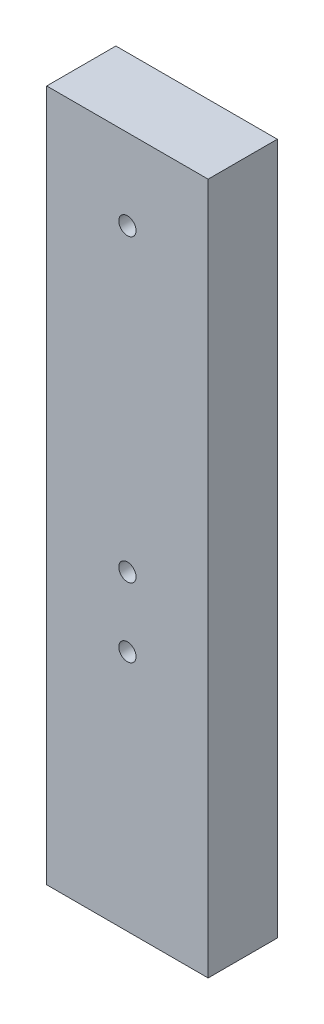
ISO-10303-21;
HEADER;
FILE_DESCRIPTION(('STEP AP214'),'2;1');
FILE_NAME('part.step','',(''),(''),'','','');
FILE_SCHEMA(('AUTOMOTIVE_DESIGN { 1 0 10303 214 1 1 1 1 }'));
ENDSEC;
DATA;
#1=APPLICATION_CONTEXT('core data for automotive mechanical design processes');
#2=APPLICATION_PROTOCOL_DEFINITION('international standard','automotive_design',2000,#1);
#3=PRODUCT_CONTEXT('',#1,'mechanical');
#4=PRODUCT('Part','Part','',(#3));
#5=PRODUCT_RELATED_PRODUCT_CATEGORY('part','',(#4));
#6=PRODUCT_DEFINITION_FORMATION('','',#4);
#7=PRODUCT_DEFINITION_CONTEXT('part definition',#1,'design');
#8=PRODUCT_DEFINITION('design','',#6,#7);
#9=PRODUCT_DEFINITION_SHAPE('','',#8);
#10=(LENGTH_UNIT() NAMED_UNIT(*) SI_UNIT(.MILLI.,.METRE.));
#11=(NAMED_UNIT(*) PLANE_ANGLE_UNIT() SI_UNIT($,.RADIAN.));
#12=(NAMED_UNIT(*) SI_UNIT($,.STERADIAN.) SOLID_ANGLE_UNIT());
#13=UNCERTAINTY_MEASURE_WITH_UNIT(LENGTH_MEASURE(1.E-05),#10,'distance_accuracy_value','');
#14=(GEOMETRIC_REPRESENTATION_CONTEXT(3) GLOBAL_UNCERTAINTY_ASSIGNED_CONTEXT((#13)) GLOBAL_UNIT_ASSIGNED_CONTEXT((#10,
#11,#12)) REPRESENTATION_CONTEXT('',''));
#15=CARTESIAN_POINT('',(0.,0.,0.));
#16=DIRECTION('',(0.,0.,1.));
#17=DIRECTION('',(1.,0.,0.));
#18=AXIS2_PLACEMENT_3D('',#15,#16,#17);
#19=CARTESIAN_POINT('',(0.,0.,38.1));
#20=DIRECTION('',(1.,0.,0.));
#21=DIRECTION('',(0.,0.,-1.));
#22=AXIS2_PLACEMENT_3D('',#19,#20,#21);
#23=PLANE('',#22);
#24=DIRECTION('',(0.,-1.,0.));
#25=VECTOR('',#24,1.);
#26=CARTESIAN_POINT('',(0.,0.,0.));
#27=LINE('',#26,#25);
#28=CARTESIAN_POINT('',(0.,381.,0.));
#29=VERTEX_POINT('',#28);
#30=CARTESIAN_POINT('',(0.,0.,0.));
#31=VERTEX_POINT('',#30);
#32=EDGE_CURVE('E99',#29,#31,#27,.T.);
#33=ORIENTED_EDGE('',*,*,#32,.T.);
#34=DIRECTION('',(0.,0.,-1.));
#35=VECTOR('',#34,1.);
#36=CARTESIAN_POINT('',(0.,0.,38.1));
#37=LINE('',#36,#35);
#38=CARTESIAN_POINT('',(0.,0.,38.1));
#39=VERTEX_POINT('',#38);
#40=EDGE_CURVE('E11',#39,#31,#37,.T.);
#41=ORIENTED_EDGE('',*,*,#40,.F.);
#42=DIRECTION('',(0.,-1.,0.));
#43=VECTOR('',#42,1.);
#44=CARTESIAN_POINT('',(0.,0.,38.1));
#45=LINE('',#44,#43);
#46=CARTESIAN_POINT('',(0.,381.,38.1));
#47=VERTEX_POINT('',#46);
#48=EDGE_CURVE('E87',#47,#39,#45,.T.);
#49=ORIENTED_EDGE('',*,*,#48,.F.);
#50=DIRECTION('',(0.,0.,-1.));
#51=VECTOR('',#50,1.);
#52=CARTESIAN_POINT('',(0.,381.,38.1));
#53=LINE('',#52,#51);
#54=EDGE_CURVE('E95',#47,#29,#53,.T.);
#55=ORIENTED_EDGE('',*,*,#54,.T.);
#56=EDGE_LOOP('',(#33,#41,#49,#55));
#57=FACE_BOUND('',#56,.T.);
#58=ADVANCED_FACE('F36',(#57),#23,.F.);
#59=CARTESIAN_POINT('',(0.,0.,38.1));
#60=DIRECTION('',(0.,1.,0.));
#61=DIRECTION('',(0.,0.,1.));
#62=AXIS2_PLACEMENT_3D('',#59,#60,#61);
#63=PLANE('',#62);
#64=DIRECTION('',(1.,0.,0.));
#65=VECTOR('',#64,1.);
#66=CARTESIAN_POINT('',(0.,0.,0.));
#67=LINE('',#66,#65);
#68=CARTESIAN_POINT('',(88.9,0.,0.));
#69=VERTEX_POINT('',#68);
#70=EDGE_CURVE('E91',#31,#69,#67,.T.);
#71=ORIENTED_EDGE('',*,*,#70,.T.);
#72=DIRECTION('',(0.,0.,-1.));
#73=VECTOR('',#72,1.);
#74=CARTESIAN_POINT('',(88.9,0.,38.1));
#75=LINE('',#74,#73);
#76=CARTESIAN_POINT('',(88.9,0.,38.1));
#77=VERTEX_POINT('',#76);
#78=EDGE_CURVE('E44',#77,#69,#75,.T.);
#79=ORIENTED_EDGE('',*,*,#78,.F.);
#80=DIRECTION('',(1.,0.,0.));
#81=VECTOR('',#80,1.);
#82=CARTESIAN_POINT('',(0.,0.,38.1));
#83=LINE('',#82,#81);
#84=EDGE_CURVE('E82',#39,#77,#83,.T.);
#85=ORIENTED_EDGE('',*,*,#84,.F.);
#86=ORIENTED_EDGE('',*,*,#40,.T.);
#87=EDGE_LOOP('',(#71,#79,#85,#86));
#88=FACE_BOUND('',#87,.T.);
#89=ADVANCED_FACE('F90',(#88),#63,.F.);
#90=CARTESIAN_POINT('',(88.9,0.,38.1));
#91=DIRECTION('',(-1.,0.,0.));
#92=DIRECTION('',(0.,0.,1.));
#93=AXIS2_PLACEMENT_3D('',#90,#91,#92);
#94=PLANE('',#93);
#95=DIRECTION('',(0.,1.,0.));
#96=VECTOR('',#95,1.);
#97=CARTESIAN_POINT('',(88.9,0.,0.));
#98=LINE('',#97,#96);
#99=CARTESIAN_POINT('',(88.9,381.,0.));
#100=VERTEX_POINT('',#99);
#101=EDGE_CURVE('E69',#69,#100,#98,.T.);
#102=ORIENTED_EDGE('',*,*,#101,.T.);
#103=DIRECTION('',(0.,0.,-1.));
#104=VECTOR('',#103,1.);
#105=CARTESIAN_POINT('',(88.9,381.,38.1));
#106=LINE('',#105,#104);
#107=CARTESIAN_POINT('',(88.9,381.,38.1));
#108=VERTEX_POINT('',#107);
#109=EDGE_CURVE('E92',#108,#100,#106,.T.);
#110=ORIENTED_EDGE('',*,*,#109,.F.);
#111=DIRECTION('',(0.,1.,0.));
#112=VECTOR('',#111,1.);
#113=CARTESIAN_POINT('',(88.9,0.,38.1));
#114=LINE('',#113,#112);
#115=EDGE_CURVE('E85',#77,#108,#114,.T.);
#116=ORIENTED_EDGE('',*,*,#115,.F.);
#117=ORIENTED_EDGE('',*,*,#78,.T.);
#118=EDGE_LOOP('',(#102,#110,#116,#117));
#119=FACE_BOUND('',#118,.T.);
#120=ADVANCED_FACE('F93',(#119),#94,.F.);
#121=CARTESIAN_POINT('',(0.,381.,38.1));
#122=DIRECTION('',(0.,-1.,0.));
#123=DIRECTION('',(0.,0.,-1.));
#124=AXIS2_PLACEMENT_3D('',#121,#122,#123);
#125=PLANE('',#124);
#126=DIRECTION('',(-1.,0.,0.));
#127=VECTOR('',#126,1.);
#128=CARTESIAN_POINT('',(0.,381.,0.));
#129=LINE('',#128,#127);
#130=EDGE_CURVE('E75',#100,#29,#129,.T.);
#131=ORIENTED_EDGE('',*,*,#130,.T.);
#132=ORIENTED_EDGE('',*,*,#54,.F.);
#133=DIRECTION('',(-1.,0.,0.));
#134=VECTOR('',#133,1.);
#135=CARTESIAN_POINT('',(0.,381.,38.1));
#136=LINE('',#135,#134);
#137=EDGE_CURVE('E52',#108,#47,#136,.T.);
#138=ORIENTED_EDGE('',*,*,#137,.F.);
#139=ORIENTED_EDGE('',*,*,#109,.T.);
#140=EDGE_LOOP('',(#131,#132,#138,#139));
#141=FACE_BOUND('',#140,.T.);
#142=ADVANCED_FACE('F107',(#141),#125,.F.);
#143=CARTESIAN_POINT('',(0.,0.,38.1));
#144=DIRECTION('',(0.,0.,-1.));
#145=DIRECTION('',(-1.,0.,0.));
#146=AXIS2_PLACEMENT_3D('',#143,#144,#145);
#147=PLANE('',#146);
#148=CARTESIAN_POINT('',(44.45,171.45,38.1));
#149=DIRECTION('',(0.,0.,1.));
#150=DIRECTION('',(1.,0.,0.));
#151=AXIS2_PLACEMENT_3D('',#148,#149,#150);
#152=CIRCLE('',#151,4.7625);
#153=CARTESIAN_POINT('',(49.2125,171.45,38.1));
#154=VERTEX_POINT('',#153);
#155=EDGE_CURVE('E125',#154,#154,#152,.T.);
#156=ORIENTED_EDGE('',*,*,#155,.F.);
#157=EDGE_LOOP('',(#156));
#158=FACE_BOUND('',#157,.T.);
#159=CARTESIAN_POINT('',(44.45,336.55,38.1));
#160=DIRECTION('',(0.,0.,1.));
#161=DIRECTION('',(1.,0.,0.));
#162=AXIS2_PLACEMENT_3D('',#159,#160,#161);
#163=CIRCLE('',#162,4.7625);
#164=CARTESIAN_POINT('',(49.2125,336.55,38.1));
#165=VERTEX_POINT('',#164);
#166=EDGE_CURVE('E119',#165,#165,#163,.T.);
#167=ORIENTED_EDGE('',*,*,#166,.F.);
#168=EDGE_LOOP('',(#167));
#169=FACE_BOUND('',#168,.T.);
#170=CARTESIAN_POINT('',(44.45,133.35,38.1));
#171=DIRECTION('',(0.,0.,1.));
#172=DIRECTION('',(1.,0.,0.));
#173=AXIS2_PLACEMENT_3D('',#170,#171,#172);
#174=CIRCLE('',#173,4.7625);
#175=CARTESIAN_POINT('',(49.2125,133.35,38.1));
#176=VERTEX_POINT('',#175);
#177=EDGE_CURVE('E113',#176,#176,#174,.T.);
#178=ORIENTED_EDGE('',*,*,#177,.F.);
#179=EDGE_LOOP('',(#178));
#180=FACE_BOUND('',#179,.T.);
#181=ORIENTED_EDGE('',*,*,#48,.T.);
#182=ORIENTED_EDGE('',*,*,#84,.T.);
#183=ORIENTED_EDGE('',*,*,#115,.T.);
#184=ORIENTED_EDGE('',*,*,#137,.T.);
#185=EDGE_LOOP('',(#181,#182,#183,#184));
#186=FACE_BOUND('',#185,.T.);
#187=ADVANCED_FACE('F83',(#158,#169,#180,#186),#147,.F.);
#188=CARTESIAN_POINT('',(0.,0.,0.));
#189=DIRECTION('',(0.,0.,-1.));
#190=DIRECTION('',(-1.,0.,0.));
#191=AXIS2_PLACEMENT_3D('',#188,#189,#190);
#192=PLANE('',#191);
#193=CARTESIAN_POINT('',(44.45,171.45,0.));
#194=DIRECTION('',(0.,0.,1.));
#195=DIRECTION('',(1.,0.,0.));
#196=AXIS2_PLACEMENT_3D('',#193,#194,#195);
#197=CIRCLE('',#196,4.7625);
#198=CARTESIAN_POINT('',(49.2125,171.45,0.));
#199=VERTEX_POINT('',#198);
#200=EDGE_CURVE('E122',#199,#199,#197,.T.);
#201=ORIENTED_EDGE('',*,*,#200,.T.);
#202=EDGE_LOOP('',(#201));
#203=FACE_BOUND('',#202,.T.);
#204=CARTESIAN_POINT('',(44.45,336.55,0.));
#205=DIRECTION('',(0.,0.,1.));
#206=DIRECTION('',(1.,0.,0.));
#207=AXIS2_PLACEMENT_3D('',#204,#205,#206);
#208=CIRCLE('',#207,4.7625);
#209=CARTESIAN_POINT('',(49.2125,336.55,0.));
#210=VERTEX_POINT('',#209);
#211=EDGE_CURVE('E116',#210,#210,#208,.T.);
#212=ORIENTED_EDGE('',*,*,#211,.T.);
#213=EDGE_LOOP('',(#212));
#214=FACE_BOUND('',#213,.T.);
#215=CARTESIAN_POINT('',(44.45,133.35,0.));
#216=DIRECTION('',(0.,0.,1.));
#217=DIRECTION('',(1.,0.,0.));
#218=AXIS2_PLACEMENT_3D('',#215,#216,#217);
#219=CIRCLE('',#218,4.7625);
#220=CARTESIAN_POINT('',(49.2125,133.35,0.));
#221=VERTEX_POINT('',#220);
#222=EDGE_CURVE('E102',#221,#221,#219,.T.);
#223=ORIENTED_EDGE('',*,*,#222,.T.);
#224=EDGE_LOOP('',(#223));
#225=FACE_BOUND('',#224,.T.);
#226=ORIENTED_EDGE('',*,*,#32,.F.);
#227=ORIENTED_EDGE('',*,*,#130,.F.);
#228=ORIENTED_EDGE('',*,*,#101,.F.);
#229=ORIENTED_EDGE('',*,*,#70,.F.);
#230=EDGE_LOOP('',(#226,#227,#228,#229));
#231=FACE_BOUND('',#230,.T.);
#232=ADVANCED_FACE('F110',(#203,#214,#225,#231),#192,.T.);
#233=CARTESIAN_POINT('',(44.45,133.35,0.));
#234=DIRECTION('',(0.,0.,1.));
#235=DIRECTION('',(1.,0.,0.));
#236=AXIS2_PLACEMENT_3D('',#233,#234,#235);
#237=CYLINDRICAL_SURFACE('',#236,4.7625);
#238=CARTESIAN_POINT('',(49.2125,133.35,0.));
#239=CARTESIAN_POINT('',(49.2125,133.35,0.396875));
#240=CARTESIAN_POINT('',(49.2125,133.35,0.79375));
#241=CARTESIAN_POINT('',(49.2125,133.35,1.5875));
#242=CARTESIAN_POINT('',(49.2125,133.35,1.984375));
#243=CARTESIAN_POINT('',(49.2125,133.35,2.778125));
#244=CARTESIAN_POINT('',(49.2125,133.35,3.175));
#245=CARTESIAN_POINT('',(49.2125,133.35,3.96875));
#246=CARTESIAN_POINT('',(49.2125,133.35,4.365625));
#247=CARTESIAN_POINT('',(49.2125,133.35,5.159375));
#248=CARTESIAN_POINT('',(49.2125,133.35,5.55625));
#249=CARTESIAN_POINT('',(49.2125,133.35,6.35));
#250=CARTESIAN_POINT('',(49.2125,133.35,6.746875));
#251=CARTESIAN_POINT('',(49.2125,133.35,7.540625));
#252=CARTESIAN_POINT('',(49.2125,133.35,7.9375));
#253=CARTESIAN_POINT('',(49.2125,133.35,8.73125));
#254=CARTESIAN_POINT('',(49.2125,133.35,9.128125));
#255=CARTESIAN_POINT('',(49.2125,133.35,9.921875));
#256=CARTESIAN_POINT('',(49.2125,133.35,10.31875));
#257=CARTESIAN_POINT('',(49.2125,133.35,11.1125));
#258=CARTESIAN_POINT('',(49.2125,133.35,11.509375));
#259=CARTESIAN_POINT('',(49.2125,133.35,12.303125));
#260=CARTESIAN_POINT('',(49.2125,133.35,12.7));
#261=CARTESIAN_POINT('',(49.2125,133.35,13.49375));
#262=CARTESIAN_POINT('',(49.2125,133.35,13.890625));
#263=CARTESIAN_POINT('',(49.2125,133.35,14.684375));
#264=CARTESIAN_POINT('',(49.2125,133.35,15.08125));
#265=CARTESIAN_POINT('',(49.2125,133.35,15.875));
#266=CARTESIAN_POINT('',(49.2125,133.35,16.271875));
#267=CARTESIAN_POINT('',(49.2125,133.35,17.065625));
#268=CARTESIAN_POINT('',(49.2125,133.35,17.4625));
#269=CARTESIAN_POINT('',(49.2125,133.35,18.25625));
#270=CARTESIAN_POINT('',(49.2125,133.35,18.653125));
#271=CARTESIAN_POINT('',(49.2125,133.35,19.446875));
#272=CARTESIAN_POINT('',(49.2125,133.35,19.84375));
#273=CARTESIAN_POINT('',(49.2125,133.35,20.6375));
#274=CARTESIAN_POINT('',(49.2125,133.35,21.034375));
#275=CARTESIAN_POINT('',(49.2125,133.35,21.828125));
#276=CARTESIAN_POINT('',(49.2125,133.35,22.225));
#277=CARTESIAN_POINT('',(49.2125,133.35,23.01875));
#278=CARTESIAN_POINT('',(49.2125,133.35,23.415625));
#279=CARTESIAN_POINT('',(49.2125,133.35,24.209375));
#280=CARTESIAN_POINT('',(49.2125,133.35,24.60625));
#281=CARTESIAN_POINT('',(49.2125,133.35,25.4));
#282=CARTESIAN_POINT('',(49.2125,133.35,25.796875));
#283=CARTESIAN_POINT('',(49.2125,133.35,26.590625));
#284=CARTESIAN_POINT('',(49.2125,133.35,26.9875));
#285=CARTESIAN_POINT('',(49.2125,133.35,27.78125));
#286=CARTESIAN_POINT('',(49.2125,133.35,28.178125));
#287=CARTESIAN_POINT('',(49.2125,133.35,28.971875));
#288=CARTESIAN_POINT('',(49.2125,133.35,29.36875));
#289=CARTESIAN_POINT('',(49.2125,133.35,30.1625));
#290=CARTESIAN_POINT('',(49.2125,133.35,30.559375));
#291=CARTESIAN_POINT('',(49.2125,133.35,31.353125));
#292=CARTESIAN_POINT('',(49.2125,133.35,31.75));
#293=CARTESIAN_POINT('',(49.2125,133.35,32.54375));
#294=CARTESIAN_POINT('',(49.2125,133.35,32.940625));
#295=CARTESIAN_POINT('',(49.2125,133.35,33.734375));
#296=CARTESIAN_POINT('',(49.2125,133.35,34.13125));
#297=CARTESIAN_POINT('',(49.2125,133.35,34.925));
#298=CARTESIAN_POINT('',(49.2125,133.35,35.321875));
#299=CARTESIAN_POINT('',(49.2125,133.35,36.115625));
#300=CARTESIAN_POINT('',(49.2125,133.35,36.5125));
#301=CARTESIAN_POINT('',(49.2125,133.35,37.30625));
#302=CARTESIAN_POINT('',(49.2125,133.35,37.703125));
#303=CARTESIAN_POINT('',(49.2125,133.35,38.1));
#304=B_SPLINE_CURVE_WITH_KNOTS('',3,(#238,#239,#240,#241,#242,#243,#244,#245,#246,#247,#248,
#249,#250,#251,#252,#253,#254,#255,#256,#257,#258,#259,#260,#261,#262,#263,#264,#265,#266,#267,
#268,#269,#270,#271,#272,#273,#274,#275,#276,#277,#278,#279,#280,#281,#282,#283,#284,#285,#286,
#287,#288,#289,#290,#291,#292,#293,#294,#295,#296,#297,#298,#299,#300,#301,#302,#303),
.UNSPECIFIED.,.F.,.F.,(4,2,2,2,2,2,2,2,2,2,2,2,2,2,2,2,2,2,2,2,2,2,2,2,2,2,2,2,2,2,2,2,4),(0.,
1.190625,2.38125,3.571875,4.7625,5.953125,7.14375,8.334375,9.525,10.715625,11.90625,13.096875,
14.2875,15.478125,16.66875,17.859375,19.05,20.240625,21.43125,22.621875,23.8125,25.003125,
26.19375,27.384375,28.575,29.765625,30.95625,32.146875,33.3375,34.528125,35.71875,36.909375,
38.1),.UNSPECIFIED.);
#305=EDGE_CURVE('BSEAM147',#221,#176,#304,.T.);
#306=ORIENTED_EDGE('',*,*,#222,.F.);
#307=ORIENTED_EDGE('',*,*,#177,.T.);
#308=ORIENTED_EDGE('',*,*,#305,.T.);
#309=ORIENTED_EDGE('',*,*,#305,.F.);
#310=EDGE_LOOP('',(#306,#308,#307,#309));
#311=FACE_BOUND('',#310,.T.);
#312=ADVANCED_FACE('F147',(#311),#237,.F.);
#313=CARTESIAN_POINT('',(44.45,336.55,0.));
#314=DIRECTION('',(0.,0.,1.));
#315=DIRECTION('',(1.,0.,0.));
#316=AXIS2_PLACEMENT_3D('',#313,#314,#315);
#317=CYLINDRICAL_SURFACE('',#316,4.7625);
#318=CARTESIAN_POINT('',(49.2125,336.55,0.));
#319=CARTESIAN_POINT('',(49.2125,336.55,0.396875));
#320=CARTESIAN_POINT('',(49.2125,336.55,0.79375));
#321=CARTESIAN_POINT('',(49.2125,336.55,1.5875));
#322=CARTESIAN_POINT('',(49.2125,336.55,1.984375));
#323=CARTESIAN_POINT('',(49.2125,336.55,2.778125));
#324=CARTESIAN_POINT('',(49.2125,336.55,3.175));
#325=CARTESIAN_POINT('',(49.2125,336.55,3.96875));
#326=CARTESIAN_POINT('',(49.2125,336.55,4.365625));
#327=CARTESIAN_POINT('',(49.2125,336.55,5.159375));
#328=CARTESIAN_POINT('',(49.2125,336.55,5.55625));
#329=CARTESIAN_POINT('',(49.2125,336.55,6.35));
#330=CARTESIAN_POINT('',(49.2125,336.55,6.746875));
#331=CARTESIAN_POINT('',(49.2125,336.55,7.540625));
#332=CARTESIAN_POINT('',(49.2125,336.55,7.9375));
#333=CARTESIAN_POINT('',(49.2125,336.55,8.73125));
#334=CARTESIAN_POINT('',(49.2125,336.55,9.128125));
#335=CARTESIAN_POINT('',(49.2125,336.55,9.921875));
#336=CARTESIAN_POINT('',(49.2125,336.55,10.31875));
#337=CARTESIAN_POINT('',(49.2125,336.55,11.1125));
#338=CARTESIAN_POINT('',(49.2125,336.55,11.509375));
#339=CARTESIAN_POINT('',(49.2125,336.55,12.303125));
#340=CARTESIAN_POINT('',(49.2125,336.55,12.7));
#341=CARTESIAN_POINT('',(49.2125,336.55,13.49375));
#342=CARTESIAN_POINT('',(49.2125,336.55,13.890625));
#343=CARTESIAN_POINT('',(49.2125,336.55,14.684375));
#344=CARTESIAN_POINT('',(49.2125,336.55,15.08125));
#345=CARTESIAN_POINT('',(49.2125,336.55,15.875));
#346=CARTESIAN_POINT('',(49.2125,336.55,16.271875));
#347=CARTESIAN_POINT('',(49.2125,336.55,17.065625));
#348=CARTESIAN_POINT('',(49.2125,336.55,17.4625));
#349=CARTESIAN_POINT('',(49.2125,336.55,18.25625));
#350=CARTESIAN_POINT('',(49.2125,336.55,18.653125));
#351=CARTESIAN_POINT('',(49.2125,336.55,19.446875));
#352=CARTESIAN_POINT('',(49.2125,336.55,19.84375));
#353=CARTESIAN_POINT('',(49.2125,336.55,20.6375));
#354=CARTESIAN_POINT('',(49.2125,336.55,21.034375));
#355=CARTESIAN_POINT('',(49.2125,336.55,21.828125));
#356=CARTESIAN_POINT('',(49.2125,336.55,22.225));
#357=CARTESIAN_POINT('',(49.2125,336.55,23.01875));
#358=CARTESIAN_POINT('',(49.2125,336.55,23.415625));
#359=CARTESIAN_POINT('',(49.2125,336.55,24.209375));
#360=CARTESIAN_POINT('',(49.2125,336.55,24.60625));
#361=CARTESIAN_POINT('',(49.2125,336.55,25.4));
#362=CARTESIAN_POINT('',(49.2125,336.55,25.796875));
#363=CARTESIAN_POINT('',(49.2125,336.55,26.590625));
#364=CARTESIAN_POINT('',(49.2125,336.55,26.9875));
#365=CARTESIAN_POINT('',(49.2125,336.55,27.78125));
#366=CARTESIAN_POINT('',(49.2125,336.55,28.178125));
#367=CARTESIAN_POINT('',(49.2125,336.55,28.971875));
#368=CARTESIAN_POINT('',(49.2125,336.55,29.36875));
#369=CARTESIAN_POINT('',(49.2125,336.55,30.1625));
#370=CARTESIAN_POINT('',(49.2125,336.55,30.559375));
#371=CARTESIAN_POINT('',(49.2125,336.55,31.353125));
#372=CARTESIAN_POINT('',(49.2125,336.55,31.75));
#373=CARTESIAN_POINT('',(49.2125,336.55,32.54375));
#374=CARTESIAN_POINT('',(49.2125,336.55,32.940625));
#375=CARTESIAN_POINT('',(49.2125,336.55,33.734375));
#376=CARTESIAN_POINT('',(49.2125,336.55,34.13125));
#377=CARTESIAN_POINT('',(49.2125,336.55,34.925));
#378=CARTESIAN_POINT('',(49.2125,336.55,35.321875));
#379=CARTESIAN_POINT('',(49.2125,336.55,36.115625));
#380=CARTESIAN_POINT('',(49.2125,336.55,36.5125));
#381=CARTESIAN_POINT('',(49.2125,336.55,37.30625));
#382=CARTESIAN_POINT('',(49.2125,336.55,37.703125));
#383=CARTESIAN_POINT('',(49.2125,336.55,38.1));
#384=B_SPLINE_CURVE_WITH_KNOTS('',3,(#318,#319,#320,#321,#322,#323,#324,#325,#326,#327,#328,
#329,#330,#331,#332,#333,#334,#335,#336,#337,#338,#339,#340,#341,#342,#343,#344,#345,#346,#347,
#348,#349,#350,#351,#352,#353,#354,#355,#356,#357,#358,#359,#360,#361,#362,#363,#364,#365,#366,
#367,#368,#369,#370,#371,#372,#373,#374,#375,#376,#377,#378,#379,#380,#381,#382,#383),
.UNSPECIFIED.,.F.,.F.,(4,2,2,2,2,2,2,2,2,2,2,2,2,2,2,2,2,2,2,2,2,2,2,2,2,2,2,2,2,2,2,2,4),(0.,
1.190625,2.38125,3.571875,4.7625,5.953125,7.14375,8.334375,9.525,10.715625,11.90625,13.096875,
14.2875,15.478125,16.66875,17.859375,19.05,20.240625,21.43125,22.621875,23.8125,25.003125,
26.19375,27.384375,28.575,29.765625,30.95625,32.146875,33.3375,34.528125,35.71875,36.909375,
38.1),.UNSPECIFIED.);
#385=EDGE_CURVE('BSEAM136',#210,#165,#384,.T.);
#386=ORIENTED_EDGE('',*,*,#211,.F.);
#387=ORIENTED_EDGE('',*,*,#166,.T.);
#388=ORIENTED_EDGE('',*,*,#385,.T.);
#389=ORIENTED_EDGE('',*,*,#385,.F.);
#390=EDGE_LOOP('',(#386,#388,#387,#389));
#391=FACE_BOUND('',#390,.T.);
#392=ADVANCED_FACE('F136',(#391),#317,.F.);
#393=CARTESIAN_POINT('',(44.45,171.45,0.));
#394=DIRECTION('',(0.,0.,1.));
#395=DIRECTION('',(1.,0.,0.));
#396=AXIS2_PLACEMENT_3D('',#393,#394,#395);
#397=CYLINDRICAL_SURFACE('',#396,4.7625);
#398=CARTESIAN_POINT('',(49.2125,171.45,0.));
#399=CARTESIAN_POINT('',(49.2125,171.45,0.396875));
#400=CARTESIAN_POINT('',(49.2125,171.45,0.79375));
#401=CARTESIAN_POINT('',(49.2125,171.45,1.5875));
#402=CARTESIAN_POINT('',(49.2125,171.45,1.984375));
#403=CARTESIAN_POINT('',(49.2125,171.45,2.778125));
#404=CARTESIAN_POINT('',(49.2125,171.45,3.175));
#405=CARTESIAN_POINT('',(49.2125,171.45,3.96875));
#406=CARTESIAN_POINT('',(49.2125,171.45,4.365625));
#407=CARTESIAN_POINT('',(49.2125,171.45,5.159375));
#408=CARTESIAN_POINT('',(49.2125,171.45,5.55625));
#409=CARTESIAN_POINT('',(49.2125,171.45,6.35));
#410=CARTESIAN_POINT('',(49.2125,171.45,6.746875));
#411=CARTESIAN_POINT('',(49.2125,171.45,7.540625));
#412=CARTESIAN_POINT('',(49.2125,171.45,7.9375));
#413=CARTESIAN_POINT('',(49.2125,171.45,8.73125));
#414=CARTESIAN_POINT('',(49.2125,171.45,9.128125));
#415=CARTESIAN_POINT('',(49.2125,171.45,9.921875));
#416=CARTESIAN_POINT('',(49.2125,171.45,10.31875));
#417=CARTESIAN_POINT('',(49.2125,171.45,11.1125));
#418=CARTESIAN_POINT('',(49.2125,171.45,11.509375));
#419=CARTESIAN_POINT('',(49.2125,171.45,12.303125));
#420=CARTESIAN_POINT('',(49.2125,171.45,12.7));
#421=CARTESIAN_POINT('',(49.2125,171.45,13.49375));
#422=CARTESIAN_POINT('',(49.2125,171.45,13.890625));
#423=CARTESIAN_POINT('',(49.2125,171.45,14.684375));
#424=CARTESIAN_POINT('',(49.2125,171.45,15.08125));
#425=CARTESIAN_POINT('',(49.2125,171.45,15.875));
#426=CARTESIAN_POINT('',(49.2125,171.45,16.271875));
#427=CARTESIAN_POINT('',(49.2125,171.45,17.065625));
#428=CARTESIAN_POINT('',(49.2125,171.45,17.4625));
#429=CARTESIAN_POINT('',(49.2125,171.45,18.25625));
#430=CARTESIAN_POINT('',(49.2125,171.45,18.653125));
#431=CARTESIAN_POINT('',(49.2125,171.45,19.446875));
#432=CARTESIAN_POINT('',(49.2125,171.45,19.84375));
#433=CARTESIAN_POINT('',(49.2125,171.45,20.6375));
#434=CARTESIAN_POINT('',(49.2125,171.45,21.034375));
#435=CARTESIAN_POINT('',(49.2125,171.45,21.828125));
#436=CARTESIAN_POINT('',(49.2125,171.45,22.225));
#437=CARTESIAN_POINT('',(49.2125,171.45,23.01875));
#438=CARTESIAN_POINT('',(49.2125,171.45,23.415625));
#439=CARTESIAN_POINT('',(49.2125,171.45,24.209375));
#440=CARTESIAN_POINT('',(49.2125,171.45,24.60625));
#441=CARTESIAN_POINT('',(49.2125,171.45,25.4));
#442=CARTESIAN_POINT('',(49.2125,171.45,25.796875));
#443=CARTESIAN_POINT('',(49.2125,171.45,26.590625));
#444=CARTESIAN_POINT('',(49.2125,171.45,26.9875));
#445=CARTESIAN_POINT('',(49.2125,171.45,27.78125));
#446=CARTESIAN_POINT('',(49.2125,171.45,28.178125));
#447=CARTESIAN_POINT('',(49.2125,171.45,28.971875));
#448=CARTESIAN_POINT('',(49.2125,171.45,29.36875));
#449=CARTESIAN_POINT('',(49.2125,171.45,30.1625));
#450=CARTESIAN_POINT('',(49.2125,171.45,30.559375));
#451=CARTESIAN_POINT('',(49.2125,171.45,31.353125));
#452=CARTESIAN_POINT('',(49.2125,171.45,31.75));
#453=CARTESIAN_POINT('',(49.2125,171.45,32.54375));
#454=CARTESIAN_POINT('',(49.2125,171.45,32.940625));
#455=CARTESIAN_POINT('',(49.2125,171.45,33.734375));
#456=CARTESIAN_POINT('',(49.2125,171.45,34.13125));
#457=CARTESIAN_POINT('',(49.2125,171.45,34.925));
#458=CARTESIAN_POINT('',(49.2125,171.45,35.321875));
#459=CARTESIAN_POINT('',(49.2125,171.45,36.115625));
#460=CARTESIAN_POINT('',(49.2125,171.45,36.5125));
#461=CARTESIAN_POINT('',(49.2125,171.45,37.30625));
#462=CARTESIAN_POINT('',(49.2125,171.45,37.703125));
#463=CARTESIAN_POINT('',(49.2125,171.45,38.1));
#464=B_SPLINE_CURVE_WITH_KNOTS('',3,(#398,#399,#400,#401,#402,#403,#404,#405,#406,#407,#408,
#409,#410,#411,#412,#413,#414,#415,#416,#417,#418,#419,#420,#421,#422,#423,#424,#425,#426,#427,
#428,#429,#430,#431,#432,#433,#434,#435,#436,#437,#438,#439,#440,#441,#442,#443,#444,#445,#446,
#447,#448,#449,#450,#451,#452,#453,#454,#455,#456,#457,#458,#459,#460,#461,#462,#463),
.UNSPECIFIED.,.F.,.F.,(4,2,2,2,2,2,2,2,2,2,2,2,2,2,2,2,2,2,2,2,2,2,2,2,2,2,2,2,2,2,2,2,4),(0.,
1.190625,2.38125,3.571875,4.7625,5.953125,7.14375,8.334375,9.525,10.715625,11.90625,13.096875,
14.2875,15.478125,16.66875,17.859375,19.05,20.240625,21.43125,22.621875,23.8125,25.003125,
26.19375,27.384375,28.575,29.765625,30.95625,32.146875,33.3375,34.528125,35.71875,36.909375,
38.1),.UNSPECIFIED.);
#465=EDGE_CURVE('BSEAM133',#199,#154,#464,.T.);
#466=ORIENTED_EDGE('',*,*,#200,.F.);
#467=ORIENTED_EDGE('',*,*,#155,.T.);
#468=ORIENTED_EDGE('',*,*,#465,.T.);
#469=ORIENTED_EDGE('',*,*,#465,.F.);
#470=EDGE_LOOP('',(#466,#468,#467,#469));
#471=FACE_BOUND('',#470,.T.);
#472=ADVANCED_FACE('F133',(#471),#397,.F.);
#473=CLOSED_SHELL('',(#58,#89,#120,#142,#187,#232,#312,#392,#472));
#474=MANIFOLD_SOLID_BREP('B2',#473);
#475=ADVANCED_BREP_SHAPE_REPRESENTATION('',(#18,#474),#14);
#476=SHAPE_DEFINITION_REPRESENTATION(#9,#475);
ENDSEC;
END-ISO-10303-21;
